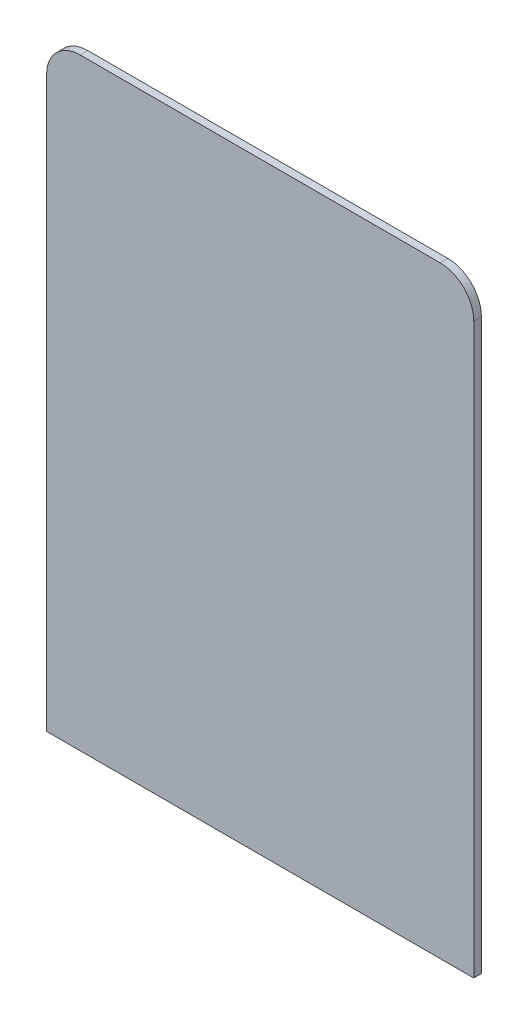
ISO-10303-21;
HEADER;
FILE_DESCRIPTION(('STEP AP214'),'2;1');
FILE_NAME('part.step','',(''),(''),'','','');
FILE_SCHEMA(('AUTOMOTIVE_DESIGN { 1 0 10303 214 1 1 1 1 }'));
ENDSEC;
DATA;
#1=APPLICATION_CONTEXT('core data for automotive mechanical design processes');
#2=APPLICATION_PROTOCOL_DEFINITION('international standard','automotive_design',2000,#1);
#3=PRODUCT_CONTEXT('',#1,'mechanical');
#4=PRODUCT('Part','Part','',(#3));
#5=PRODUCT_RELATED_PRODUCT_CATEGORY('part','',(#4));
#6=PRODUCT_DEFINITION_FORMATION('','',#4);
#7=PRODUCT_DEFINITION_CONTEXT('part definition',#1,'design');
#8=PRODUCT_DEFINITION('design','',#6,#7);
#9=PRODUCT_DEFINITION_SHAPE('','',#8);
#10=(LENGTH_UNIT() NAMED_UNIT(*) SI_UNIT(.MILLI.,.METRE.));
#11=(NAMED_UNIT(*) PLANE_ANGLE_UNIT() SI_UNIT($,.RADIAN.));
#12=(NAMED_UNIT(*) SI_UNIT($,.STERADIAN.) SOLID_ANGLE_UNIT());
#13=UNCERTAINTY_MEASURE_WITH_UNIT(LENGTH_MEASURE(1.E-05),#10,'distance_accuracy_value','');
#14=(GEOMETRIC_REPRESENTATION_CONTEXT(3) GLOBAL_UNCERTAINTY_ASSIGNED_CONTEXT((#13)) GLOBAL_UNIT_ASSIGNED_CONTEXT((#10,
#11,#12)) REPRESENTATION_CONTEXT('',''));
#15=CARTESIAN_POINT('',(0.,0.,0.));
#16=DIRECTION('',(0.,0.,1.));
#17=DIRECTION('',(1.,0.,0.));
#18=AXIS2_PLACEMENT_3D('',#15,#16,#17);
#19=CARTESIAN_POINT('',(-92.075,0.,3.175));
#20=DIRECTION('',(0.,1.,0.));
#21=DIRECTION('',(-1.,0.,0.));
#22=AXIS2_PLACEMENT_3D('',#19,#20,#21);
#23=PLANE('',#22);
#24=DIRECTION('',(0.,0.,1.));
#25=VECTOR('',#24,1.);
#26=CARTESIAN_POINT('',(-88.9000000000001,0.,0.));
#27=LINE('',#26,#25);
#28=CARTESIAN_POINT('',(-88.9000000000001,0.,0.));
#29=VERTEX_POINT('',#28);
#30=CARTESIAN_POINT('',(-88.9000000000001,0.,3.175));
#31=VERTEX_POINT('',#30);
#32=EDGE_CURVE('E101',#29,#31,#27,.T.);
#33=ORIENTED_EDGE('',*,*,#32,.F.);
#34=DIRECTION('',(1.,0.,0.));
#35=VECTOR('',#34,1.);
#36=CARTESIAN_POINT('',(-92.075,0.,0.));
#37=LINE('',#36,#35);
#38=CARTESIAN_POINT('',(88.9,0.,0.));
#39=VERTEX_POINT('',#38);
#40=EDGE_CURVE('E36',#29,#39,#37,.T.);
#41=ORIENTED_EDGE('',*,*,#40,.T.);
#42=DIRECTION('',(0.,0.,1.));
#43=VECTOR('',#42,1.);
#44=CARTESIAN_POINT('',(88.9,0.,0.));
#45=LINE('',#44,#43);
#46=CARTESIAN_POINT('',(88.9,0.,3.175));
#47=VERTEX_POINT('',#46);
#48=EDGE_CURVE('E91',#39,#47,#45,.T.);
#49=ORIENTED_EDGE('',*,*,#48,.T.);
#50=DIRECTION('',(1.,0.,0.));
#51=VECTOR('',#50,1.);
#52=CARTESIAN_POINT('',(-92.075,0.,3.175));
#53=LINE('',#52,#51);
#54=EDGE_CURVE('E11',#31,#47,#53,.T.);
#55=ORIENTED_EDGE('',*,*,#54,.F.);
#56=EDGE_LOOP('',(#33,#41,#49,#55));
#57=FACE_BOUND('',#56,.T.);
#58=ADVANCED_FACE('F33',(#57),#23,.F.);
#59=CARTESIAN_POINT('',(-74.9300000000001,236.855,3.175));
#60=DIRECTION('',(0.,0.,1.));
#61=DIRECTION('',(1.,0.,0.));
#62=AXIS2_PLACEMENT_3D('',#59,#60,#61);
#63=PLANE('',#62);
#64=CARTESIAN_POINT('',(-74.9300000000001,236.855,3.175));
#65=DIRECTION('',(0.,0.,1.));
#66=DIRECTION('',(1.,0.,0.));
#67=AXIS2_PLACEMENT_3D('',#64,#65,#66);
#68=CIRCLE('',#67,13.97);
#69=CARTESIAN_POINT('',(-74.93,250.825,3.175));
#70=VERTEX_POINT('',#69);
#71=CARTESIAN_POINT('',(-88.9000000000001,236.855,3.175));
#72=VERTEX_POINT('',#71);
#73=EDGE_CURVE('E127',#70,#72,#68,.T.);
#74=ORIENTED_EDGE('',*,*,#73,.T.);
#75=DIRECTION('',(0.,-1.,0.));
#76=VECTOR('',#75,1.);
#77=CARTESIAN_POINT('',(-88.9000000000001,0.,3.175));
#78=LINE('',#77,#76);
#79=EDGE_CURVE('E81',#72,#31,#78,.T.);
#80=ORIENTED_EDGE('',*,*,#79,.T.);
#81=ORIENTED_EDGE('',*,*,#54,.T.);
#82=DIRECTION('',(0.,1.,0.));
#83=VECTOR('',#82,1.);
#84=CARTESIAN_POINT('',(88.9,0.,3.175));
#85=LINE('',#84,#83);
#86=CARTESIAN_POINT('',(88.9,236.855,3.175));
#87=VERTEX_POINT('',#86);
#88=EDGE_CURVE('E97',#47,#87,#85,.T.);
#89=ORIENTED_EDGE('',*,*,#88,.T.);
#90=CARTESIAN_POINT('',(74.93,236.855,3.175));
#91=DIRECTION('',(0.,0.,1.));
#92=DIRECTION('',(1.,0.,0.));
#93=AXIS2_PLACEMENT_3D('',#90,#91,#92);
#94=CIRCLE('',#93,13.97);
#95=CARTESIAN_POINT('',(74.9299999999999,250.825,3.175));
#96=VERTEX_POINT('',#95);
#97=EDGE_CURVE('E132',#87,#96,#94,.T.);
#98=ORIENTED_EDGE('',*,*,#97,.T.);
#99=DIRECTION('',(-1.,0.,0.));
#100=VECTOR('',#99,1.);
#101=CARTESIAN_POINT('',(0.,250.825,3.175));
#102=LINE('',#101,#100);
#103=EDGE_CURVE('E129',#96,#70,#102,.T.);
#104=ORIENTED_EDGE('',*,*,#103,.T.);
#105=EDGE_LOOP('',(#74,#80,#81,#89,#98,#104));
#106=FACE_BOUND('',#105,.T.);
#107=ADVANCED_FACE('F140',(#106),#63,.T.);
#108=CARTESIAN_POINT('',(-74.9300000000001,236.855,0.));
#109=DIRECTION('',(0.,0.,1.));
#110=DIRECTION('',(1.,0.,0.));
#111=AXIS2_PLACEMENT_3D('',#108,#109,#110);
#112=PLANE('',#111);
#113=DIRECTION('',(0.,-1.,0.));
#114=VECTOR('',#113,1.);
#115=CARTESIAN_POINT('',(-88.9000000000001,0.,0.));
#116=LINE('',#115,#114);
#117=CARTESIAN_POINT('',(-88.9000000000001,236.855,0.));
#118=VERTEX_POINT('',#117);
#119=EDGE_CURVE('E110',#118,#29,#116,.T.);
#120=ORIENTED_EDGE('',*,*,#119,.F.);
#121=CARTESIAN_POINT('',(-74.9300000000001,236.855,0.));
#122=DIRECTION('',(0.,0.,1.));
#123=DIRECTION('',(1.,0.,0.));
#124=AXIS2_PLACEMENT_3D('',#121,#122,#123);
#125=CIRCLE('',#124,13.97);
#126=CARTESIAN_POINT('',(-74.93,250.825,0.));
#127=VERTEX_POINT('',#126);
#128=EDGE_CURVE('E56',#127,#118,#125,.T.);
#129=ORIENTED_EDGE('',*,*,#128,.F.);
#130=DIRECTION('',(-1.,0.,0.));
#131=VECTOR('',#130,1.);
#132=CARTESIAN_POINT('',(0.,250.825,0.));
#133=LINE('',#132,#131);
#134=CARTESIAN_POINT('',(74.9299999999999,250.825,0.));
#135=VERTEX_POINT('',#134);
#136=EDGE_CURVE('E85',#135,#127,#133,.T.);
#137=ORIENTED_EDGE('',*,*,#136,.F.);
#138=CARTESIAN_POINT('',(74.93,236.855,0.));
#139=DIRECTION('',(0.,0.,1.));
#140=DIRECTION('',(1.,0.,0.));
#141=AXIS2_PLACEMENT_3D('',#138,#139,#140);
#142=CIRCLE('',#141,13.97);
#143=CARTESIAN_POINT('',(88.9,236.855,0.));
#144=VERTEX_POINT('',#143);
#145=EDGE_CURVE('E109',#144,#135,#142,.T.);
#146=ORIENTED_EDGE('',*,*,#145,.F.);
#147=DIRECTION('',(0.,1.,0.));
#148=VECTOR('',#147,1.);
#149=CARTESIAN_POINT('',(88.9,0.,0.));
#150=LINE('',#149,#148);
#151=EDGE_CURVE('E94',#39,#144,#150,.T.);
#152=ORIENTED_EDGE('',*,*,#151,.F.);
#153=ORIENTED_EDGE('',*,*,#40,.F.);
#154=EDGE_LOOP('',(#120,#129,#137,#146,#152,#153));
#155=FACE_BOUND('',#154,.T.);
#156=ADVANCED_FACE('F108',(#155),#112,.F.);
#157=CARTESIAN_POINT('',(-74.9300000000001,236.855,0.));
#158=DIRECTION('',(0.,0.,1.));
#159=DIRECTION('',(1.,0.,0.));
#160=AXIS2_PLACEMENT_3D('',#157,#158,#159);
#161=CYLINDRICAL_SURFACE('',#160,13.97);
#162=ORIENTED_EDGE('',*,*,#73,.F.);
#163=DIRECTION('',(0.,0.,1.));
#164=VECTOR('',#163,1.);
#165=CARTESIAN_POINT('',(-74.93,250.825,0.));
#166=LINE('',#165,#164);
#167=EDGE_CURVE('E123',#127,#70,#166,.T.);
#168=ORIENTED_EDGE('',*,*,#167,.F.);
#169=ORIENTED_EDGE('',*,*,#128,.T.);
#170=DIRECTION('',(0.,0.,1.));
#171=VECTOR('',#170,1.);
#172=CARTESIAN_POINT('',(-88.9000000000001,236.855,0.));
#173=LINE('',#172,#171);
#174=EDGE_CURVE('E113',#118,#72,#173,.T.);
#175=ORIENTED_EDGE('',*,*,#174,.T.);
#176=EDGE_LOOP('',(#162,#168,#169,#175));
#177=FACE_BOUND('',#176,.T.);
#178=ADVANCED_FACE('F157',(#177),#161,.T.);
#179=CARTESIAN_POINT('',(-88.9000000000001,0.,0.));
#180=DIRECTION('',(-1.,0.,0.));
#181=DIRECTION('',(0.,-1.,0.));
#182=AXIS2_PLACEMENT_3D('',#179,#180,#181);
#183=PLANE('',#182);
#184=ORIENTED_EDGE('',*,*,#79,.F.);
#185=ORIENTED_EDGE('',*,*,#174,.F.);
#186=ORIENTED_EDGE('',*,*,#119,.T.);
#187=ORIENTED_EDGE('',*,*,#32,.T.);
#188=EDGE_LOOP('',(#184,#185,#186,#187));
#189=FACE_BOUND('',#188,.T.);
#190=ADVANCED_FACE('F159',(#189),#183,.T.);
#191=CARTESIAN_POINT('',(88.9,0.,0.));
#192=DIRECTION('',(1.,0.,0.));
#193=DIRECTION('',(0.,0.,-1.));
#194=AXIS2_PLACEMENT_3D('',#191,#192,#193);
#195=PLANE('',#194);
#196=ORIENTED_EDGE('',*,*,#88,.F.);
#197=ORIENTED_EDGE('',*,*,#48,.F.);
#198=ORIENTED_EDGE('',*,*,#151,.T.);
#199=DIRECTION('',(0.,0.,1.));
#200=VECTOR('',#199,1.);
#201=CARTESIAN_POINT('',(88.9,236.855,0.));
#202=LINE('',#201,#200);
#203=EDGE_CURVE('E102',#144,#87,#202,.T.);
#204=ORIENTED_EDGE('',*,*,#203,.T.);
#205=EDGE_LOOP('',(#196,#197,#198,#204));
#206=FACE_BOUND('',#205,.T.);
#207=ADVANCED_FACE('F93',(#206),#195,.T.);
#208=CARTESIAN_POINT('',(74.93,236.855,0.));
#209=DIRECTION('',(0.,0.,1.));
#210=DIRECTION('',(1.,0.,0.));
#211=AXIS2_PLACEMENT_3D('',#208,#209,#210);
#212=CYLINDRICAL_SURFACE('',#211,13.97);
#213=ORIENTED_EDGE('',*,*,#97,.F.);
#214=ORIENTED_EDGE('',*,*,#203,.F.);
#215=ORIENTED_EDGE('',*,*,#145,.T.);
#216=DIRECTION('',(0.,0.,1.));
#217=VECTOR('',#216,1.);
#218=CARTESIAN_POINT('',(74.9299999999999,250.825,0.));
#219=LINE('',#218,#217);
#220=EDGE_CURVE('E47',#135,#96,#219,.T.);
#221=ORIENTED_EDGE('',*,*,#220,.T.);
#222=EDGE_LOOP('',(#213,#214,#215,#221));
#223=FACE_BOUND('',#222,.T.);
#224=ADVANCED_FACE('F139',(#223),#212,.T.);
#225=CARTESIAN_POINT('',(0.,250.825,0.));
#226=DIRECTION('',(0.,1.,0.));
#227=DIRECTION('',(0.,0.,1.));
#228=AXIS2_PLACEMENT_3D('',#225,#226,#227);
#229=PLANE('',#228);
#230=ORIENTED_EDGE('',*,*,#103,.F.);
#231=ORIENTED_EDGE('',*,*,#220,.F.);
#232=ORIENTED_EDGE('',*,*,#136,.T.);
#233=ORIENTED_EDGE('',*,*,#167,.T.);
#234=EDGE_LOOP('',(#230,#231,#232,#233));
#235=FACE_BOUND('',#234,.T.);
#236=ADVANCED_FACE('F141',(#235),#229,.T.);
#237=CLOSED_SHELL('',(#58,#107,#156,#178,#190,#207,#224,#236));
#238=MANIFOLD_SOLID_BREP('B2',#237);
#239=ADVANCED_BREP_SHAPE_REPRESENTATION('',(#18,#238),#14);
#240=SHAPE_DEFINITION_REPRESENTATION(#9,#239);
ENDSEC;
END-ISO-10303-21;
